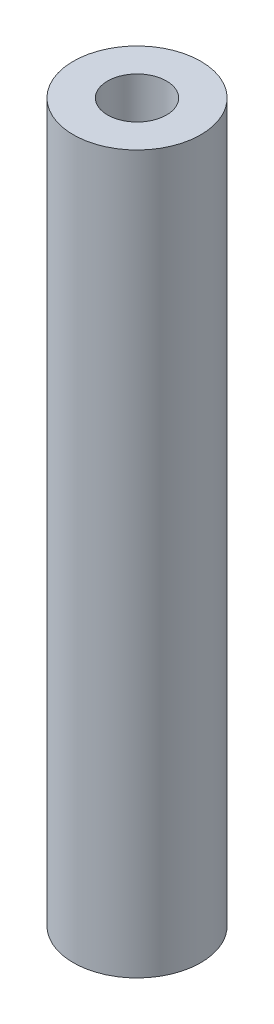
ISO-10303-21;
HEADER;
FILE_DESCRIPTION(('STEP AP214'),'2;1');
FILE_NAME('part.step','',(''),(''),'','','');
FILE_SCHEMA(('AUTOMOTIVE_DESIGN { 1 0 10303 214 1 1 1 1 }'));
ENDSEC;
DATA;
#1=APPLICATION_CONTEXT('core data for automotive mechanical design processes');
#2=APPLICATION_PROTOCOL_DEFINITION('international standard','automotive_design',2000,#1);
#3=PRODUCT_CONTEXT('',#1,'mechanical');
#4=PRODUCT('Part','Part','',(#3));
#5=PRODUCT_RELATED_PRODUCT_CATEGORY('part','',(#4));
#6=PRODUCT_DEFINITION_FORMATION('','',#4);
#7=PRODUCT_DEFINITION_CONTEXT('part definition',#1,'design');
#8=PRODUCT_DEFINITION('design','',#6,#7);
#9=PRODUCT_DEFINITION_SHAPE('','',#8);
#10=(LENGTH_UNIT() NAMED_UNIT(*) SI_UNIT(.MILLI.,.METRE.));
#11=(NAMED_UNIT(*) PLANE_ANGLE_UNIT() SI_UNIT($,.RADIAN.));
#12=(NAMED_UNIT(*) SI_UNIT($,.STERADIAN.) SOLID_ANGLE_UNIT());
#13=UNCERTAINTY_MEASURE_WITH_UNIT(LENGTH_MEASURE(1.E-05),#10,'distance_accuracy_value','');
#14=(GEOMETRIC_REPRESENTATION_CONTEXT(3) GLOBAL_UNCERTAINTY_ASSIGNED_CONTEXT((#13)) GLOBAL_UNIT_ASSIGNED_CONTEXT((#10,
#11,#12)) REPRESENTATION_CONTEXT('',''));
#15=CARTESIAN_POINT('',(0.,0.,0.));
#16=DIRECTION('',(0.,0.,1.));
#17=DIRECTION('',(1.,0.,0.));
#18=AXIS2_PLACEMENT_3D('',#15,#16,#17);
#19=CARTESIAN_POINT('',(0.,45.,0.));
#20=DIRECTION('',(0.,1.,0.));
#21=DIRECTION('',(0.,0.,1.));
#22=AXIS2_PLACEMENT_3D('',#19,#20,#21);
#23=PLANE('',#22);
#24=CARTESIAN_POINT('',(0.,45.,0.));
#25=DIRECTION('',(0.,1.,0.));
#26=DIRECTION('',(0.,0.,1.));
#27=AXIS2_PLACEMENT_3D('',#24,#25,#26);
#28=CIRCLE('',#27,4.);
#29=CARTESIAN_POINT('',(0.,45.,-4.));
#30=VERTEX_POINT('',#29);
#31=EDGE_CURVE('E10',#30,#30,#28,.T.);
#32=ORIENTED_EDGE('',*,*,#31,.T.);
#33=EDGE_LOOP('',(#32));
#34=FACE_BOUND('',#33,.T.);
#35=CARTESIAN_POINT('',(0.,45.,0.));
#36=DIRECTION('',(0.,1.,0.));
#37=DIRECTION('',(0.,0.,1.));
#38=AXIS2_PLACEMENT_3D('',#35,#36,#37);
#39=CIRCLE('',#38,1.85);
#40=CARTESIAN_POINT('',(0.,45.,-1.85));
#41=VERTEX_POINT('',#40);
#42=EDGE_CURVE('E45',#41,#41,#39,.T.);
#43=ORIENTED_EDGE('',*,*,#42,.F.);
#44=EDGE_LOOP('',(#43));
#45=FACE_BOUND('',#44,.T.);
#46=ADVANCED_FACE('F34',(#34,#45),#23,.T.);
#47=CARTESIAN_POINT('',(0.,0.,0.));
#48=DIRECTION('',(0.,1.,0.));
#49=DIRECTION('',(0.,0.,1.));
#50=AXIS2_PLACEMENT_3D('',#47,#48,#49);
#51=PLANE('',#50);
#52=CARTESIAN_POINT('',(0.,0.,0.));
#53=DIRECTION('',(0.,1.,0.));
#54=DIRECTION('',(0.,0.,1.));
#55=AXIS2_PLACEMENT_3D('',#52,#53,#54);
#56=CIRCLE('',#55,4.);
#57=CARTESIAN_POINT('',(0.,0.,-4.));
#58=VERTEX_POINT('',#57);
#59=EDGE_CURVE('E38',#58,#58,#56,.T.);
#60=ORIENTED_EDGE('',*,*,#59,.F.);
#61=EDGE_LOOP('',(#60));
#62=FACE_BOUND('',#61,.T.);
#63=CARTESIAN_POINT('',(0.,0.,0.));
#64=DIRECTION('',(0.,1.,0.));
#65=DIRECTION('',(0.,0.,1.));
#66=AXIS2_PLACEMENT_3D('',#63,#64,#65);
#67=CIRCLE('',#66,1.85);
#68=CARTESIAN_POINT('',(0.,0.,-1.85));
#69=VERTEX_POINT('',#68);
#70=EDGE_CURVE('E47',#69,#69,#67,.T.);
#71=ORIENTED_EDGE('',*,*,#70,.T.);
#72=EDGE_LOOP('',(#71));
#73=FACE_BOUND('',#72,.T.);
#74=ADVANCED_FACE('F57',(#62,#73),#51,.F.);
#75=CARTESIAN_POINT('',(0.,45.,0.));
#76=DIRECTION('',(0.,-1.,0.));
#77=DIRECTION('',(0.,0.,-1.));
#78=AXIS2_PLACEMENT_3D('',#75,#76,#77);
#79=CYLINDRICAL_SURFACE('',#78,4.);
#80=CARTESIAN_POINT('',(0.,45.,-4.));
#81=CARTESIAN_POINT('',(0.,44.53125,-4.));
#82=CARTESIAN_POINT('',(0.,44.0625,-4.));
#83=CARTESIAN_POINT('',(0.,43.125,-4.));
#84=CARTESIAN_POINT('',(0.,42.65625,-4.));
#85=CARTESIAN_POINT('',(0.,41.71875,-4.));
#86=CARTESIAN_POINT('',(0.,41.25,-4.));
#87=CARTESIAN_POINT('',(0.,40.3125,-4.));
#88=CARTESIAN_POINT('',(0.,39.84375,-4.));
#89=CARTESIAN_POINT('',(0.,38.90625,-4.));
#90=CARTESIAN_POINT('',(0.,38.4375,-4.));
#91=CARTESIAN_POINT('',(0.,37.5,-4.));
#92=CARTESIAN_POINT('',(0.,37.03125,-4.));
#93=CARTESIAN_POINT('',(0.,36.09375,-4.));
#94=CARTESIAN_POINT('',(0.,35.625,-4.));
#95=CARTESIAN_POINT('',(0.,34.6875,-4.));
#96=CARTESIAN_POINT('',(0.,34.21875,-4.));
#97=CARTESIAN_POINT('',(0.,33.28125,-4.));
#98=CARTESIAN_POINT('',(0.,32.8125,-4.));
#99=CARTESIAN_POINT('',(0.,31.875,-4.));
#100=CARTESIAN_POINT('',(0.,31.40625,-4.));
#101=CARTESIAN_POINT('',(0.,30.46875,-4.));
#102=CARTESIAN_POINT('',(0.,30.,-4.));
#103=CARTESIAN_POINT('',(0.,29.0625,-4.));
#104=CARTESIAN_POINT('',(0.,28.59375,-4.));
#105=CARTESIAN_POINT('',(0.,27.65625,-4.));
#106=CARTESIAN_POINT('',(0.,27.1875,-4.));
#107=CARTESIAN_POINT('',(0.,26.25,-4.));
#108=CARTESIAN_POINT('',(0.,25.78125,-4.));
#109=CARTESIAN_POINT('',(0.,24.84375,-4.));
#110=CARTESIAN_POINT('',(0.,24.375,-4.));
#111=CARTESIAN_POINT('',(0.,23.4375,-4.));
#112=CARTESIAN_POINT('',(0.,22.96875,-4.));
#113=CARTESIAN_POINT('',(0.,22.03125,-4.));
#114=CARTESIAN_POINT('',(0.,21.5625,-4.));
#115=CARTESIAN_POINT('',(0.,20.625,-4.));
#116=CARTESIAN_POINT('',(0.,20.15625,-4.));
#117=CARTESIAN_POINT('',(0.,19.21875,-4.));
#118=CARTESIAN_POINT('',(0.,18.75,-4.));
#119=CARTESIAN_POINT('',(0.,17.8125,-4.));
#120=CARTESIAN_POINT('',(0.,17.34375,-4.));
#121=CARTESIAN_POINT('',(0.,16.40625,-4.));
#122=CARTESIAN_POINT('',(0.,15.9375,-4.));
#123=CARTESIAN_POINT('',(0.,15.,-4.));
#124=CARTESIAN_POINT('',(0.,14.53125,-4.));
#125=CARTESIAN_POINT('',(0.,13.59375,-4.));
#126=CARTESIAN_POINT('',(0.,13.125,-4.));
#127=CARTESIAN_POINT('',(0.,12.1875,-4.));
#128=CARTESIAN_POINT('',(0.,11.71875,-4.));
#129=CARTESIAN_POINT('',(0.,10.78125,-4.));
#130=CARTESIAN_POINT('',(0.,10.3125,-4.));
#131=CARTESIAN_POINT('',(0.,9.37499999999999,-4.));
#132=CARTESIAN_POINT('',(0.,8.90624999999999,-4.));
#133=CARTESIAN_POINT('',(0.,7.96874999999999,-4.));
#134=CARTESIAN_POINT('',(0.,7.5,-4.));
#135=CARTESIAN_POINT('',(0.,6.56249999999999,-4.));
#136=CARTESIAN_POINT('',(0.,6.09374999999999,-4.));
#137=CARTESIAN_POINT('',(0.,5.15624999999999,-4.));
#138=CARTESIAN_POINT('',(0.,4.68749999999999,-4.));
#139=CARTESIAN_POINT('',(0.,3.74999999999999,-4.));
#140=CARTESIAN_POINT('',(0.,3.28124999999999,-4.));
#141=CARTESIAN_POINT('',(0.,2.34374999999999,-4.));
#142=CARTESIAN_POINT('',(0.,1.87499999999999,-4.));
#143=CARTESIAN_POINT('',(0.,0.937499999999992,-4.));
#144=CARTESIAN_POINT('',(0.,0.468749999999993,-4.));
#145=CARTESIAN_POINT('',(0.,0.,-4.));
#146=B_SPLINE_CURVE_WITH_KNOTS('',3,(#80,#81,#82,#83,#84,#85,#86,#87,#88,#89,#90,#91,#92,#93,
#94,#95,#96,#97,#98,#99,#100,#101,#102,#103,#104,#105,#106,#107,#108,#109,#110,#111,#112,#113,
#114,#115,#116,#117,#118,#119,#120,#121,#122,#123,#124,#125,#126,#127,#128,#129,#130,#131,#132,
#133,#134,#135,#136,#137,#138,#139,#140,#141,#142,#143,#144,#145),.UNSPECIFIED.,.F.,.F.,(4,2,2,
2,2,2,2,2,2,2,2,2,2,2,2,2,2,2,2,2,2,2,2,2,2,2,2,2,2,2,2,2,4),(0.,1.40625,2.8125,
4.21874999999999,5.625,7.03125,8.43749999999999,9.84375,11.25,12.65625,14.0625,15.46875,16.875,
18.28125,19.6875,21.09375,22.5,23.90625,25.3125,26.71875,28.125,29.53125,30.9375,32.34375,33.75,
35.15625,36.5625,37.96875,39.375,40.78125,42.1875,43.59375,45.),.UNSPECIFIED.);
#147=EDGE_CURVE('BSEAM36',#30,#58,#146,.T.);
#148=ORIENTED_EDGE('',*,*,#31,.F.);
#149=ORIENTED_EDGE('',*,*,#59,.T.);
#150=ORIENTED_EDGE('',*,*,#147,.T.);
#151=ORIENTED_EDGE('',*,*,#147,.F.);
#152=EDGE_LOOP('',(#148,#150,#149,#151));
#153=FACE_BOUND('',#152,.T.);
#154=ADVANCED_FACE('F36',(#153),#79,.T.);
#155=CARTESIAN_POINT('',(0.,45.,0.));
#156=DIRECTION('',(0.,-1.,0.));
#157=DIRECTION('',(0.,0.,-1.));
#158=AXIS2_PLACEMENT_3D('',#155,#156,#157);
#159=CYLINDRICAL_SURFACE('',#158,1.85);
#160=CARTESIAN_POINT('',(0.,45.,-1.85));
#161=CARTESIAN_POINT('',(0.,44.53125,-1.85));
#162=CARTESIAN_POINT('',(0.,44.0625,-1.85));
#163=CARTESIAN_POINT('',(0.,43.125,-1.85));
#164=CARTESIAN_POINT('',(0.,42.65625,-1.85));
#165=CARTESIAN_POINT('',(0.,41.71875,-1.85));
#166=CARTESIAN_POINT('',(0.,41.25,-1.85));
#167=CARTESIAN_POINT('',(0.,40.3125,-1.85));
#168=CARTESIAN_POINT('',(0.,39.84375,-1.85));
#169=CARTESIAN_POINT('',(0.,38.90625,-1.85));
#170=CARTESIAN_POINT('',(0.,38.4375,-1.85));
#171=CARTESIAN_POINT('',(0.,37.5,-1.85));
#172=CARTESIAN_POINT('',(0.,37.03125,-1.85));
#173=CARTESIAN_POINT('',(0.,36.09375,-1.85));
#174=CARTESIAN_POINT('',(0.,35.625,-1.85));
#175=CARTESIAN_POINT('',(0.,34.6875,-1.85));
#176=CARTESIAN_POINT('',(0.,34.21875,-1.85));
#177=CARTESIAN_POINT('',(0.,33.28125,-1.85));
#178=CARTESIAN_POINT('',(0.,32.8125,-1.85));
#179=CARTESIAN_POINT('',(0.,31.875,-1.85));
#180=CARTESIAN_POINT('',(0.,31.40625,-1.85));
#181=CARTESIAN_POINT('',(0.,30.46875,-1.85));
#182=CARTESIAN_POINT('',(0.,30.,-1.85));
#183=CARTESIAN_POINT('',(0.,29.0625,-1.85));
#184=CARTESIAN_POINT('',(0.,28.59375,-1.85));
#185=CARTESIAN_POINT('',(0.,27.65625,-1.85));
#186=CARTESIAN_POINT('',(0.,27.1875,-1.85));
#187=CARTESIAN_POINT('',(0.,26.25,-1.85));
#188=CARTESIAN_POINT('',(0.,25.78125,-1.85));
#189=CARTESIAN_POINT('',(0.,24.84375,-1.85));
#190=CARTESIAN_POINT('',(0.,24.375,-1.85));
#191=CARTESIAN_POINT('',(0.,23.4375,-1.85));
#192=CARTESIAN_POINT('',(0.,22.96875,-1.85));
#193=CARTESIAN_POINT('',(0.,22.03125,-1.85));
#194=CARTESIAN_POINT('',(0.,21.5625,-1.85));
#195=CARTESIAN_POINT('',(0.,20.625,-1.85));
#196=CARTESIAN_POINT('',(0.,20.15625,-1.85));
#197=CARTESIAN_POINT('',(0.,19.21875,-1.85));
#198=CARTESIAN_POINT('',(0.,18.75,-1.85));
#199=CARTESIAN_POINT('',(0.,17.8125,-1.85));
#200=CARTESIAN_POINT('',(0.,17.34375,-1.85));
#201=CARTESIAN_POINT('',(0.,16.40625,-1.85));
#202=CARTESIAN_POINT('',(0.,15.9375,-1.85));
#203=CARTESIAN_POINT('',(0.,15.,-1.85));
#204=CARTESIAN_POINT('',(0.,14.53125,-1.85));
#205=CARTESIAN_POINT('',(0.,13.59375,-1.85));
#206=CARTESIAN_POINT('',(0.,13.125,-1.85));
#207=CARTESIAN_POINT('',(0.,12.1875,-1.85));
#208=CARTESIAN_POINT('',(0.,11.71875,-1.85));
#209=CARTESIAN_POINT('',(0.,10.78125,-1.85));
#210=CARTESIAN_POINT('',(0.,10.3125,-1.85));
#211=CARTESIAN_POINT('',(0.,9.37499999999999,-1.85));
#212=CARTESIAN_POINT('',(0.,8.90624999999999,-1.85));
#213=CARTESIAN_POINT('',(0.,7.96874999999999,-1.85));
#214=CARTESIAN_POINT('',(0.,7.5,-1.85));
#215=CARTESIAN_POINT('',(0.,6.56249999999999,-1.85));
#216=CARTESIAN_POINT('',(0.,6.09374999999999,-1.85));
#217=CARTESIAN_POINT('',(0.,5.15624999999999,-1.85));
#218=CARTESIAN_POINT('',(0.,4.68749999999999,-1.85));
#219=CARTESIAN_POINT('',(0.,3.74999999999999,-1.85));
#220=CARTESIAN_POINT('',(0.,3.28124999999999,-1.85));
#221=CARTESIAN_POINT('',(0.,2.34374999999999,-1.85));
#222=CARTESIAN_POINT('',(0.,1.87499999999999,-1.85));
#223=CARTESIAN_POINT('',(0.,0.937499999999992,-1.85));
#224=CARTESIAN_POINT('',(0.,0.468749999999993,-1.85));
#225=CARTESIAN_POINT('',(0.,0.,-1.85));
#226=B_SPLINE_CURVE_WITH_KNOTS('',3,(#160,#161,#162,#163,#164,#165,#166,#167,#168,#169,#170,
#171,#172,#173,#174,#175,#176,#177,#178,#179,#180,#181,#182,#183,#184,#185,#186,#187,#188,#189,
#190,#191,#192,#193,#194,#195,#196,#197,#198,#199,#200,#201,#202,#203,#204,#205,#206,#207,#208,
#209,#210,#211,#212,#213,#214,#215,#216,#217,#218,#219,#220,#221,#222,#223,#224,#225),
.UNSPECIFIED.,.F.,.F.,(4,2,2,2,2,2,2,2,2,2,2,2,2,2,2,2,2,2,2,2,2,2,2,2,2,2,2,2,2,2,2,2,4),(0.,
1.40625,2.8125,4.21874999999999,5.625,7.03125,8.43749999999999,9.84375,11.25,12.65625,14.0625,
15.46875,16.875,18.28125,19.6875,21.09375,22.5,23.90625,25.3125,26.71875,28.125,29.53125,
30.9375,32.34375,33.75,35.15625,36.5625,37.96875,39.375,40.78125,42.1875,43.59375,45.),.UNSPECIFIED.);
#227=EDGE_CURVE('BSEAM53',#41,#69,#226,.T.);
#228=ORIENTED_EDGE('',*,*,#42,.T.);
#229=ORIENTED_EDGE('',*,*,#70,.F.);
#230=ORIENTED_EDGE('',*,*,#227,.T.);
#231=ORIENTED_EDGE('',*,*,#227,.F.);
#232=EDGE_LOOP('',(#228,#230,#229,#231));
#233=FACE_BOUND('',#232,.T.);
#234=ADVANCED_FACE('F53',(#233),#159,.F.);
#235=CLOSED_SHELL('',(#46,#74,#154,#234));
#236=MANIFOLD_SOLID_BREP('B2',#235);
#237=ADVANCED_BREP_SHAPE_REPRESENTATION('',(#18,#236),#14);
#238=SHAPE_DEFINITION_REPRESENTATION(#9,#237);
ENDSEC;
END-ISO-10303-21;
